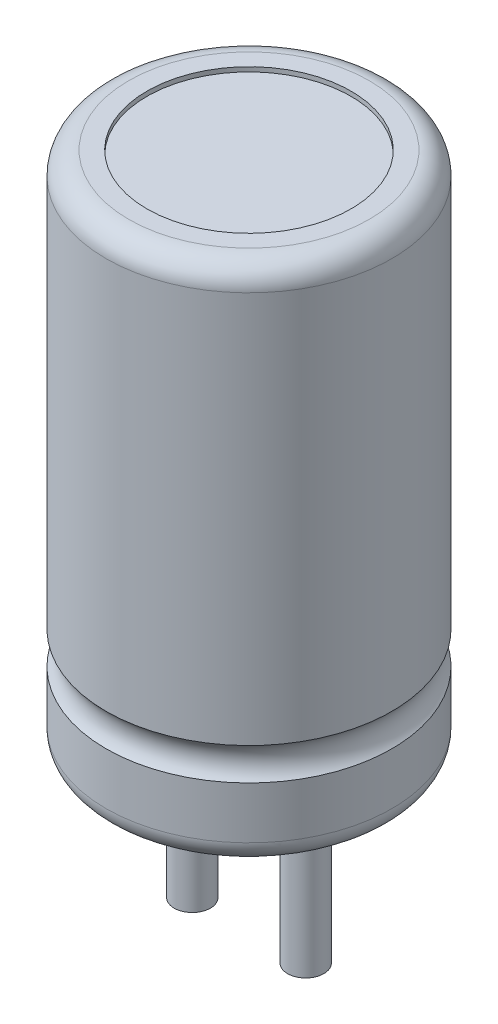
ISO-10303-21;
HEADER;
FILE_DESCRIPTION(('STEP AP214'),'2;1');
FILE_NAME('part.step','',(''),(''),'','','');
FILE_SCHEMA(('AUTOMOTIVE_DESIGN { 1 0 10303 214 1 1 1 1 }'));
ENDSEC;
DATA;
#1=APPLICATION_CONTEXT('core data for automotive mechanical design processes');
#2=APPLICATION_PROTOCOL_DEFINITION('international standard','automotive_design',2000,#1);
#3=PRODUCT_CONTEXT('',#1,'mechanical');
#4=PRODUCT('Part','Part','',(#3));
#5=PRODUCT_RELATED_PRODUCT_CATEGORY('part','',(#4));
#6=PRODUCT_DEFINITION_FORMATION('','',#4);
#7=PRODUCT_DEFINITION_CONTEXT('part definition',#1,'design');
#8=PRODUCT_DEFINITION('design','',#6,#7);
#9=PRODUCT_DEFINITION_SHAPE('','',#8);
#10=(LENGTH_UNIT() NAMED_UNIT(*) SI_UNIT(.MILLI.,.METRE.));
#11=(NAMED_UNIT(*) PLANE_ANGLE_UNIT() SI_UNIT($,.RADIAN.));
#12=(NAMED_UNIT(*) SI_UNIT($,.STERADIAN.) SOLID_ANGLE_UNIT());
#13=UNCERTAINTY_MEASURE_WITH_UNIT(LENGTH_MEASURE(1.E-05),#10,'distance_accuracy_value','');
#14=(GEOMETRIC_REPRESENTATION_CONTEXT(3) GLOBAL_UNCERTAINTY_ASSIGNED_CONTEXT((#13)) GLOBAL_UNIT_ASSIGNED_CONTEXT((#10,
#11,#12)) REPRESENTATION_CONTEXT('',''));
#15=CARTESIAN_POINT('',(0.,0.,0.));
#16=DIRECTION('',(0.,0.,1.));
#17=DIRECTION('',(1.,0.,0.));
#18=AXIS2_PLACEMENT_3D('',#15,#16,#17);
#19=CARTESIAN_POINT('',(1.25,-3.4,0.));
#20=DIRECTION('',(0.,-1.,0.));
#21=DIRECTION('',(0.,0.,-1.));
#22=AXIS2_PLACEMENT_3D('',#19,#20,#21);
#23=PLANE('',#22);
#24=CARTESIAN_POINT('',(1.25,-3.4,0.));
#25=DIRECTION('',(0.,1.,0.));
#26=DIRECTION('',(0.,0.,1.));
#27=AXIS2_PLACEMENT_3D('',#24,#25,#26);
#28=CIRCLE('',#27,0.4);
#29=CARTESIAN_POINT('',(1.25,-3.4,0.4));
#30=VERTEX_POINT('',#29);
#31=EDGE_CURVE('E188',#30,#30,#28,.T.);
#32=ORIENTED_EDGE('',*,*,#31,.F.);
#33=EDGE_LOOP('',(#32));
#34=FACE_BOUND('',#33,.T.);
#35=ADVANCED_FACE('F17',(#34),#23,.T.);
#36=CARTESIAN_POINT('',(-1.25,-3.4,0.));
#37=DIRECTION('',(0.,-1.,0.));
#38=DIRECTION('',(0.,0.,-1.));
#39=AXIS2_PLACEMENT_3D('',#36,#37,#38);
#40=PLANE('',#39);
#41=CARTESIAN_POINT('',(-1.25,-3.4,0.));
#42=DIRECTION('',(0.,1.,0.));
#43=DIRECTION('',(0.,0.,1.));
#44=AXIS2_PLACEMENT_3D('',#41,#42,#43);
#45=CIRCLE('',#44,0.4);
#46=CARTESIAN_POINT('',(-1.25,-3.4,0.4));
#47=VERTEX_POINT('',#46);
#48=EDGE_CURVE('E185',#47,#47,#45,.T.);
#49=ORIENTED_EDGE('',*,*,#48,.F.);
#50=EDGE_LOOP('',(#49));
#51=FACE_BOUND('',#50,.T.);
#52=ADVANCED_FACE('F203',(#51),#40,.T.);
#53=CARTESIAN_POINT('',(1.25,-3.4,0.));
#54=DIRECTION('',(0.,1.,0.));
#55=DIRECTION('',(0.,0.,1.));
#56=AXIS2_PLACEMENT_3D('',#53,#54,#55);
#57=CYLINDRICAL_SURFACE('',#56,0.4);
#58=CARTESIAN_POINT('',(1.25,0.0999999999999998,0.));
#59=DIRECTION('',(0.,1.,0.));
#60=DIRECTION('',(0.,0.,1.));
#61=AXIS2_PLACEMENT_3D('',#58,#59,#60);
#62=CIRCLE('',#61,0.4);
#63=CARTESIAN_POINT('',(1.25,0.0999999999999998,0.4));
#64=VERTEX_POINT('',#63);
#65=EDGE_CURVE('E182',#64,#64,#62,.T.);
#66=ORIENTED_EDGE('',*,*,#65,.F.);
#67=EDGE_LOOP('',(#66));
#68=FACE_BOUND('',#67,.T.);
#69=ORIENTED_EDGE('',*,*,#31,.T.);
#70=EDGE_LOOP('',(#69));
#71=FACE_BOUND('',#70,.T.);
#72=ADVANCED_FACE('F200',(#68,#71),#57,.T.);
#73=CARTESIAN_POINT('',(-1.25,-3.4,0.));
#74=DIRECTION('',(0.,1.,0.));
#75=DIRECTION('',(0.,0.,1.));
#76=AXIS2_PLACEMENT_3D('',#73,#74,#75);
#77=CYLINDRICAL_SURFACE('',#76,0.4);
#78=CARTESIAN_POINT('',(-1.25,0.0999999999999998,0.));
#79=DIRECTION('',(0.,1.,0.));
#80=DIRECTION('',(0.,0.,1.));
#81=AXIS2_PLACEMENT_3D('',#78,#79,#80);
#82=CIRCLE('',#81,0.4);
#83=CARTESIAN_POINT('',(-1.25,0.0999999999999998,0.4));
#84=VERTEX_POINT('',#83);
#85=EDGE_CURVE('E179',#84,#84,#82,.T.);
#86=ORIENTED_EDGE('',*,*,#85,.F.);
#87=EDGE_LOOP('',(#86));
#88=FACE_BOUND('',#87,.T.);
#89=ORIENTED_EDGE('',*,*,#48,.T.);
#90=EDGE_LOOP('',(#89));
#91=FACE_BOUND('',#90,.T.);
#92=ADVANCED_FACE('F211',(#88,#91),#77,.T.);
#93=CARTESIAN_POINT('',(-2.25,0.0999999999999999,0.));
#94=DIRECTION('',(0.,-1.,0.));
#95=DIRECTION('',(0.,0.,-1.));
#96=AXIS2_PLACEMENT_3D('',#93,#94,#95);
#97=PLANE('',#96);
#98=CARTESIAN_POINT('',(0.,0.100000000000003,0.));
#99=DIRECTION('',(0.,1.,0.));
#100=DIRECTION('',(0.,0.,1.));
#101=AXIS2_PLACEMENT_3D('',#98,#99,#100);
#102=CIRCLE('',#101,2.25);
#103=CARTESIAN_POINT('',(0.,0.100000000000003,2.25));
#104=VERTEX_POINT('',#103);
#105=EDGE_CURVE('E176',#104,#104,#102,.F.);
#106=ORIENTED_EDGE('',*,*,#105,.T.);
#107=EDGE_LOOP('',(#106));
#108=FACE_BOUND('',#107,.T.);
#109=ORIENTED_EDGE('',*,*,#85,.T.);
#110=EDGE_LOOP('',(#109));
#111=FACE_BOUND('',#110,.T.);
#112=ORIENTED_EDGE('',*,*,#65,.T.);
#113=EDGE_LOOP('',(#112));
#114=FACE_BOUND('',#113,.T.);
#115=ADVANCED_FACE('F218',(#108,#111,#114),#97,.T.);
#116=CARTESIAN_POINT('',(0.,42.5565122190237,0.));
#117=DIRECTION('',(0.,1.,0.));
#118=DIRECTION('',(0.,0.,1.));
#119=AXIS2_PLACEMENT_3D('',#116,#117,#118);
#120=CYLINDRICAL_SURFACE('',#119,2.25);
#121=ORIENTED_EDGE('',*,*,#105,.F.);
#122=EDGE_LOOP('',(#121));
#123=FACE_BOUND('',#122,.T.);
#124=CARTESIAN_POINT('',(0.,0.,0.));
#125=DIRECTION('',(0.,1.,0.));
#126=DIRECTION('',(0.,0.,1.));
#127=AXIS2_PLACEMENT_3D('',#124,#125,#126);
#128=CIRCLE('',#127,2.25);
#129=CARTESIAN_POINT('',(0.,0.,2.25));
#130=VERTEX_POINT('',#129);
#131=EDGE_CURVE('E53',#130,#130,#128,.T.);
#132=ORIENTED_EDGE('',*,*,#131,.F.);
#133=EDGE_LOOP('',(#132));
#134=FACE_BOUND('',#133,.T.);
#135=ADVANCED_FACE('F221',(#123,#134),#120,.F.);
#136=CARTESIAN_POINT('',(-2.25,0.,0.));
#137=DIRECTION('',(0.,-1.,0.));
#138=DIRECTION('',(0.,0.,-1.));
#139=AXIS2_PLACEMENT_3D('',#136,#137,#138);
#140=PLANE('',#139);
#141=CARTESIAN_POINT('',(0.,0.,0.));
#142=DIRECTION('',(0.,1.,0.));
#143=DIRECTION('',(0.,0.,1.));
#144=AXIS2_PLACEMENT_3D('',#141,#142,#143);
#145=CIRCLE('',#144,2.65);
#146=CARTESIAN_POINT('',(0.,0.,2.65));
#147=VERTEX_POINT('',#146);
#148=CARTESIAN_POINT('',(0.,0.,-2.65));
#149=VERTEX_POINT('',#148);
#150=EDGE_CURVE('E45',#147,#149,#145,.T.);
#151=ORIENTED_EDGE('',*,*,#150,.F.);
#152=CARTESIAN_POINT('',(0.,0.,0.));
#153=DIRECTION('',(0.,1.,0.));
#154=DIRECTION('',(0.,0.,-1.));
#155=AXIS2_PLACEMENT_3D('',#152,#153,#154);
#156=CIRCLE('',#155,2.65);
#157=EDGE_CURVE('E48',#149,#147,#156,.T.);
#158=ORIENTED_EDGE('',*,*,#157,.F.);
#159=EDGE_LOOP('',(#151,#158));
#160=FACE_BOUND('',#159,.T.);
#161=ORIENTED_EDGE('',*,*,#131,.T.);
#162=EDGE_LOOP('',(#161));
#163=FACE_BOUND('',#162,.T.);
#164=ADVANCED_FACE('F50',(#160,#163),#140,.T.);
#165=CARTESIAN_POINT('',(0.,0.5,0.));
#166=DIRECTION('',(0.,1.,0.));
#167=DIRECTION('',(0.,0.,1.));
#168=AXIS2_PLACEMENT_3D('',#165,#166,#167);
#169=TOROIDAL_SURFACE('',#168,2.65,0.5);
#170=CARTESIAN_POINT('',(0.,0.5,0.));
#171=DIRECTION('',(0.,1.,0.));
#172=DIRECTION('',(0.,0.,1.));
#173=AXIS2_PLACEMENT_3D('',#170,#171,#172);
#174=CIRCLE('',#173,3.15);
#175=CARTESIAN_POINT('',(0.,0.5,3.15));
#176=VERTEX_POINT('',#175);
#177=EDGE_CURVE('E58',#176,#176,#174,.T.);
#178=ORIENTED_EDGE('',*,*,#177,.F.);
#179=EDGE_LOOP('',(#178));
#180=FACE_BOUND('',#179,.T.);
#181=ORIENTED_EDGE('',*,*,#150,.T.);
#182=ORIENTED_EDGE('',*,*,#157,.T.);
#183=EDGE_LOOP('',(#181,#182));
#184=FACE_BOUND('',#183,.T.);
#185=ADVANCED_FACE('F57',(#180,#184),#169,.T.);
#186=CARTESIAN_POINT('',(-2.25,11.4,0.));
#187=DIRECTION('',(0.,1.,0.));
#188=DIRECTION('',(0.,0.,1.));
#189=AXIS2_PLACEMENT_3D('',#186,#187,#188);
#190=PLANE('',#189);
#191=CARTESIAN_POINT('',(0.,11.4,0.));
#192=DIRECTION('',(0.,1.,0.));
#193=DIRECTION('',(0.,0.,1.));
#194=AXIS2_PLACEMENT_3D('',#191,#192,#193);
#195=CIRCLE('',#194,2.25);
#196=CARTESIAN_POINT('',(0.,11.4,2.25));
#197=VERTEX_POINT('',#196);
#198=EDGE_CURVE('E94',#197,#197,#195,.T.);
#199=ORIENTED_EDGE('',*,*,#198,.T.);
#200=EDGE_LOOP('',(#199));
#201=FACE_BOUND('',#200,.T.);
#202=ADVANCED_FACE('F77',(#201),#190,.T.);
#203=CARTESIAN_POINT('',(0.,42.5565122190237,0.));
#204=DIRECTION('',(0.,1.,0.));
#205=DIRECTION('',(0.,0.,1.));
#206=AXIS2_PLACEMENT_3D('',#203,#204,#205);
#207=CYLINDRICAL_SURFACE('',#206,3.15);
#208=CARTESIAN_POINT('',(0.,1.64292857857286,0.));
#209=DIRECTION('',(0.,1.,0.));
#210=DIRECTION('',(0.,0.,1.));
#211=AXIS2_PLACEMENT_3D('',#208,#209,#210);
#212=CIRCLE('',#211,3.15);
#213=CARTESIAN_POINT('',(0.,1.64292857857286,3.15));
#214=VERTEX_POINT('',#213);
#215=EDGE_CURVE('E95',#214,#214,#212,.F.);
#216=ORIENTED_EDGE('',*,*,#215,.T.);
#217=EDGE_LOOP('',(#216));
#218=FACE_BOUND('',#217,.T.);
#219=ORIENTED_EDGE('',*,*,#177,.T.);
#220=EDGE_LOOP('',(#219));
#221=FACE_BOUND('',#220,.T.);
#222=ADVANCED_FACE('F148',(#218,#221),#207,.T.);
#223=CARTESIAN_POINT('',(0.,42.5565122190237,0.));
#224=DIRECTION('',(0.,1.,0.));
#225=DIRECTION('',(0.,0.,1.));
#226=AXIS2_PLACEMENT_3D('',#223,#224,#225);
#227=CYLINDRICAL_SURFACE('',#226,2.25);
#228=CARTESIAN_POINT('',(0.,11.5,0.));
#229=DIRECTION('',(0.,1.,0.));
#230=DIRECTION('',(0.,0.,1.));
#231=AXIS2_PLACEMENT_3D('',#228,#229,#230);
#232=CIRCLE('',#231,2.25);
#233=CARTESIAN_POINT('',(0.,11.5,2.25));
#234=VERTEX_POINT('',#233);
#235=EDGE_CURVE('E66',#234,#234,#232,.F.);
#236=ORIENTED_EDGE('',*,*,#235,.F.);
#237=EDGE_LOOP('',(#236));
#238=FACE_BOUND('',#237,.T.);
#239=ORIENTED_EDGE('',*,*,#198,.F.);
#240=EDGE_LOOP('',(#239));
#241=FACE_BOUND('',#240,.T.);
#242=ADVANCED_FACE('F137',(#238,#241),#227,.F.);
#243=CARTESIAN_POINT('',(-2.65,11.5,0.));
#244=DIRECTION('',(0.,1.,0.));
#245=DIRECTION('',(0.,0.,1.));
#246=AXIS2_PLACEMENT_3D('',#243,#244,#245);
#247=PLANE('',#246);
#248=ORIENTED_EDGE('',*,*,#235,.T.);
#249=EDGE_LOOP('',(#248));
#250=FACE_BOUND('',#249,.T.);
#251=CARTESIAN_POINT('',(0.,11.5,0.));
#252=DIRECTION('',(0.,-1.,0.));
#253=DIRECTION('',(0.,0.,-1.));
#254=AXIS2_PLACEMENT_3D('',#251,#252,#253);
#255=CIRCLE('',#254,2.65);
#256=CARTESIAN_POINT('',(0.,11.5,-2.65));
#257=VERTEX_POINT('',#256);
#258=CARTESIAN_POINT('',(0.,11.5,2.65));
#259=VERTEX_POINT('',#258);
#260=EDGE_CURVE('E125',#257,#259,#255,.T.);
#261=ORIENTED_EDGE('',*,*,#260,.F.);
#262=CARTESIAN_POINT('',(0.,11.5,0.));
#263=DIRECTION('',(0.,-1.,0.));
#264=DIRECTION('',(0.,0.,1.));
#265=AXIS2_PLACEMENT_3D('',#262,#263,#264);
#266=CIRCLE('',#265,2.65);
#267=EDGE_CURVE('E36',#259,#257,#266,.T.);
#268=ORIENTED_EDGE('',*,*,#267,.F.);
#269=EDGE_LOOP('',(#261,#268));
#270=FACE_BOUND('',#269,.T.);
#271=ADVANCED_FACE('F128',(#250,#270),#247,.T.);
#272=CARTESIAN_POINT('',(0.,2.,0.));
#273=DIRECTION('',(0.,1.,0.));
#274=DIRECTION('',(0.,0.,1.));
#275=AXIS2_PLACEMENT_3D('',#272,#273,#274);
#276=TOROIDAL_SURFACE('',#275,3.5,0.5);
#277=ORIENTED_EDGE('',*,*,#215,.F.);
#278=EDGE_LOOP('',(#277));
#279=FACE_BOUND('',#278,.T.);
#280=CARTESIAN_POINT('',(0.,2.35707142142714,0.));
#281=DIRECTION('',(0.,1.,0.));
#282=DIRECTION('',(0.,0.,1.));
#283=AXIS2_PLACEMENT_3D('',#280,#281,#282);
#284=CIRCLE('',#283,3.15);
#285=CARTESIAN_POINT('',(0.,2.35707142142714,3.15));
#286=VERTEX_POINT('',#285);
#287=EDGE_CURVE('E28',#286,#286,#284,.T.);
#288=ORIENTED_EDGE('',*,*,#287,.F.);
#289=EDGE_LOOP('',(#288));
#290=FACE_BOUND('',#289,.T.);
#291=ADVANCED_FACE('F115',(#279,#290),#276,.F.);
#292=CARTESIAN_POINT('',(0.,11.,0.));
#293=DIRECTION('',(0.,1.,0.));
#294=DIRECTION('',(0.,0.,1.));
#295=AXIS2_PLACEMENT_3D('',#292,#293,#294);
#296=TOROIDAL_SURFACE('',#295,2.65,0.5);
#297=ORIENTED_EDGE('',*,*,#267,.T.);
#298=ORIENTED_EDGE('',*,*,#260,.T.);
#299=EDGE_LOOP('',(#297,#298));
#300=FACE_BOUND('',#299,.T.);
#301=CARTESIAN_POINT('',(0.,11.,0.));
#302=DIRECTION('',(0.,1.,0.));
#303=DIRECTION('',(0.,0.,1.));
#304=AXIS2_PLACEMENT_3D('',#301,#302,#303);
#305=CIRCLE('',#304,3.15);
#306=CARTESIAN_POINT('',(0.,11.,3.15));
#307=VERTEX_POINT('',#306);
#308=EDGE_CURVE('E11',#307,#307,#305,.F.);
#309=ORIENTED_EDGE('',*,*,#308,.F.);
#310=EDGE_LOOP('',(#309));
#311=FACE_BOUND('',#310,.T.);
#312=ADVANCED_FACE('F103',(#300,#311),#296,.T.);
#313=CARTESIAN_POINT('',(0.,42.5565122190237,0.));
#314=DIRECTION('',(0.,1.,0.));
#315=DIRECTION('',(0.,0.,1.));
#316=AXIS2_PLACEMENT_3D('',#313,#314,#315);
#317=CYLINDRICAL_SURFACE('',#316,3.15);
#318=ORIENTED_EDGE('',*,*,#308,.T.);
#319=EDGE_LOOP('',(#318));
#320=FACE_BOUND('',#319,.T.);
#321=ORIENTED_EDGE('',*,*,#287,.T.);
#322=EDGE_LOOP('',(#321));
#323=FACE_BOUND('',#322,.T.);
#324=ADVANCED_FACE('F114',(#320,#323),#317,.T.);
#325=CLOSED_SHELL('',(#35,#52,#72,#92,#115,#135,#164,#185,#202,#222,#242,#271,#291,#312,#324));
#326=MANIFOLD_SOLID_BREP('B1',#325);
#327=ADVANCED_BREP_SHAPE_REPRESENTATION('',(#18,#326),#14);
#328=SHAPE_DEFINITION_REPRESENTATION(#9,#327);
ENDSEC;
END-ISO-10303-21;
